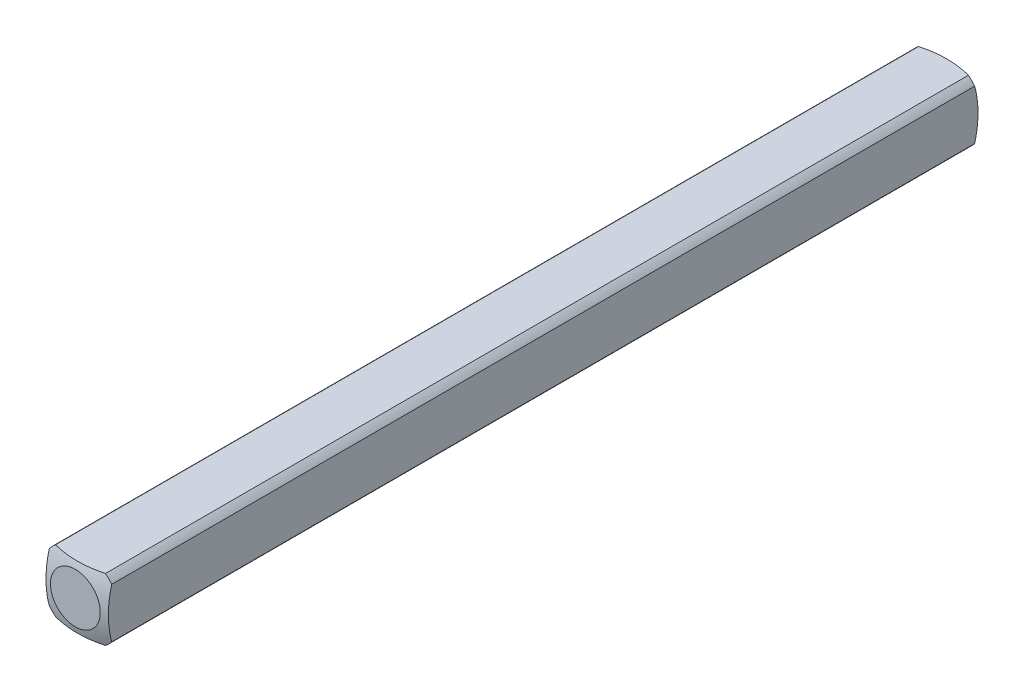
ISO-10303-21;
HEADER;
FILE_DESCRIPTION(('STEP AP214'),'2;1');
FILE_NAME('part.step','',(''),(''),'','','');
FILE_SCHEMA(('AUTOMOTIVE_DESIGN { 1 0 10303 214 1 1 1 1 }'));
ENDSEC;
DATA;
#1=APPLICATION_CONTEXT('core data for automotive mechanical design processes');
#2=APPLICATION_PROTOCOL_DEFINITION('international standard','automotive_design',2000,#1);
#3=PRODUCT_CONTEXT('',#1,'mechanical');
#4=PRODUCT('Part','Part','',(#3));
#5=PRODUCT_RELATED_PRODUCT_CATEGORY('part','',(#4));
#6=PRODUCT_DEFINITION_FORMATION('','',#4);
#7=PRODUCT_DEFINITION_CONTEXT('part definition',#1,'design');
#8=PRODUCT_DEFINITION('design','',#6,#7);
#9=PRODUCT_DEFINITION_SHAPE('','',#8);
#10=(LENGTH_UNIT() NAMED_UNIT(*) SI_UNIT(.MILLI.,.METRE.));
#11=(NAMED_UNIT(*) PLANE_ANGLE_UNIT() SI_UNIT($,.RADIAN.));
#12=(NAMED_UNIT(*) SI_UNIT($,.STERADIAN.) SOLID_ANGLE_UNIT());
#13=UNCERTAINTY_MEASURE_WITH_UNIT(LENGTH_MEASURE(1.E-05),#10,'distance_accuracy_value','');
#14=(GEOMETRIC_REPRESENTATION_CONTEXT(3) GLOBAL_UNCERTAINTY_ASSIGNED_CONTEXT((#13)) GLOBAL_UNIT_ASSIGNED_CONTEXT((#10,
#11,#12)) REPRESENTATION_CONTEXT('',''));
#15=CARTESIAN_POINT('',(0.,0.,0.));
#16=DIRECTION('',(0.,0.,1.));
#17=DIRECTION('',(1.,0.,0.));
#18=AXIS2_PLACEMENT_3D('',#15,#16,#17);
#19=CARTESIAN_POINT('',(-1.5875,-1.5875,22.225));
#20=DIRECTION('',(1.,0.,0.));
#21=DIRECTION('',(0.,0.,-1.));
#22=AXIS2_PLACEMENT_3D('',#19,#20,#21);
#23=PLANE('',#22);
#24=CARTESIAN_POINT('',(-1.5875,0.,4.91912226376204));
#25=DIRECTION('',(1.,0.,0.));
#26=DIRECTION('',(0.,0.,-1.));
#27=AXIS2_PLACEMENT_3D('',#24,#25,#26);
#28=CIRCLE('',#27,4.82558221875869);
#29=CARTESIAN_POINT('',(-1.5875,-1.26841150657032,0.263225357686904));
#30=VERTEX_POINT('',#29);
#31=CARTESIAN_POINT('',(-1.5875,1.26841150657032,0.263225357686903));
#32=VERTEX_POINT('',#31);
#33=EDGE_CURVE('E50',#30,#32,#28,.T.);
#34=ORIENTED_EDGE('',*,*,#33,.F.);
#35=DIRECTION('',(0.,0.,-1.));
#36=VECTOR('',#35,1.);
#37=CARTESIAN_POINT('',(-1.5875,-1.26841150657032,22.225));
#38=LINE('',#37,#36);
#39=CARTESIAN_POINT('',(-1.5875,-1.26841150657032,44.1867746423131));
#40=VERTEX_POINT('',#39);
#41=EDGE_CURVE('E43',#40,#30,#38,.T.);
#42=ORIENTED_EDGE('',*,*,#41,.F.);
#43=CARTESIAN_POINT('',(-1.5875,0.,39.530877736238));
#44=DIRECTION('',(-1.,0.,0.));
#45=DIRECTION('',(0.,0.,1.));
#46=AXIS2_PLACEMENT_3D('',#43,#44,#45);
#47=CIRCLE('',#46,4.82558221875869);
#48=CARTESIAN_POINT('',(-1.5875,1.26841150657032,44.1867746423131));
#49=VERTEX_POINT('',#48);
#50=EDGE_CURVE('E126',#40,#49,#47,.T.);
#51=ORIENTED_EDGE('',*,*,#50,.T.);
#52=DIRECTION('',(0.,0.,-1.));
#53=VECTOR('',#52,1.);
#54=CARTESIAN_POINT('',(-1.5875,1.26841150657032,22.225));
#55=LINE('',#54,#53);
#56=EDGE_CURVE('E114',#32,#49,#55,.F.);
#57=ORIENTED_EDGE('',*,*,#56,.F.);
#58=EDGE_LOOP('',(#34,#42,#51,#57));
#59=FACE_BOUND('',#58,.T.);
#60=ADVANCED_FACE('F36',(#59),#23,.F.);
#61=CARTESIAN_POINT('',(-1.5875,-1.5875,22.225));
#62=DIRECTION('',(0.,1.,0.));
#63=DIRECTION('',(0.,0.,1.));
#64=AXIS2_PLACEMENT_3D('',#61,#62,#63);
#65=PLANE('',#64);
#66=CARTESIAN_POINT('',(0.,-1.5875,4.91912226376204));
#67=DIRECTION('',(0.,1.,0.));
#68=DIRECTION('',(0.,0.,1.));
#69=AXIS2_PLACEMENT_3D('',#66,#67,#68);
#70=CIRCLE('',#69,4.82558221875869);
#71=CARTESIAN_POINT('',(1.26841150657032,-1.5875,0.263225357686905));
#72=VERTEX_POINT('',#71);
#73=CARTESIAN_POINT('',(-1.26841150657032,-1.5875,0.263225357686904));
#74=VERTEX_POINT('',#73);
#75=EDGE_CURVE('E155',#72,#74,#70,.T.);
#76=ORIENTED_EDGE('',*,*,#75,.F.);
#77=DIRECTION('',(0.,0.,-1.));
#78=VECTOR('',#77,1.);
#79=CARTESIAN_POINT('',(1.26841150657032,-1.5875,22.225));
#80=LINE('',#79,#78);
#81=CARTESIAN_POINT('',(1.26841150657032,-1.5875,44.1867746423131));
#82=VERTEX_POINT('',#81);
#83=EDGE_CURVE('E168',#82,#72,#80,.T.);
#84=ORIENTED_EDGE('',*,*,#83,.F.);
#85=CARTESIAN_POINT('',(0.,-1.5875,39.530877736238));
#86=DIRECTION('',(0.,-1.,0.));
#87=DIRECTION('',(0.,0.,-1.));
#88=AXIS2_PLACEMENT_3D('',#85,#86,#87);
#89=CIRCLE('',#88,4.82558221875869);
#90=CARTESIAN_POINT('',(-1.26841150657032,-1.5875,44.1867746423131));
#91=VERTEX_POINT('',#90);
#92=EDGE_CURVE('E137',#82,#91,#89,.T.);
#93=ORIENTED_EDGE('',*,*,#92,.T.);
#94=DIRECTION('',(0.,0.,-1.));
#95=VECTOR('',#94,1.);
#96=CARTESIAN_POINT('',(-1.26841150657032,-1.5875,22.225));
#97=LINE('',#96,#95);
#98=EDGE_CURVE('E166',#74,#91,#97,.F.);
#99=ORIENTED_EDGE('',*,*,#98,.F.);
#100=EDGE_LOOP('',(#76,#84,#93,#99));
#101=FACE_BOUND('',#100,.T.);
#102=ADVANCED_FACE('F178',(#101),#65,.F.);
#103=CARTESIAN_POINT('',(1.5875,-1.5875,22.225));
#104=DIRECTION('',(-1.,0.,0.));
#105=DIRECTION('',(0.,0.,1.));
#106=AXIS2_PLACEMENT_3D('',#103,#104,#105);
#107=PLANE('',#106);
#108=CARTESIAN_POINT('',(1.5875,0.,4.91912226376204));
#109=DIRECTION('',(-1.,0.,0.));
#110=DIRECTION('',(0.,0.,1.));
#111=AXIS2_PLACEMENT_3D('',#108,#109,#110);
#112=CIRCLE('',#111,4.82558221875869);
#113=CARTESIAN_POINT('',(1.5875,1.26841150657032,0.263225357686904));
#114=VERTEX_POINT('',#113);
#115=CARTESIAN_POINT('',(1.5875,-1.26841150657032,0.263225357686904));
#116=VERTEX_POINT('',#115);
#117=EDGE_CURVE('E153',#114,#116,#112,.T.);
#118=ORIENTED_EDGE('',*,*,#117,.F.);
#119=DIRECTION('',(0.,0.,-1.));
#120=VECTOR('',#119,1.);
#121=CARTESIAN_POINT('',(1.5875,1.26841150657032,22.225));
#122=LINE('',#121,#120);
#123=CARTESIAN_POINT('',(1.5875,1.26841150657032,44.1867746423131));
#124=VERTEX_POINT('',#123);
#125=EDGE_CURVE('E163',#124,#114,#122,.T.);
#126=ORIENTED_EDGE('',*,*,#125,.F.);
#127=CARTESIAN_POINT('',(1.5875,0.,39.530877736238));
#128=DIRECTION('',(1.,0.,0.));
#129=DIRECTION('',(0.,0.,-1.));
#130=AXIS2_PLACEMENT_3D('',#127,#128,#129);
#131=CIRCLE('',#130,4.82558221875869);
#132=CARTESIAN_POINT('',(1.5875,-1.26841150657032,44.1867746423131));
#133=VERTEX_POINT('',#132);
#134=EDGE_CURVE('E134',#124,#133,#131,.T.);
#135=ORIENTED_EDGE('',*,*,#134,.T.);
#136=DIRECTION('',(0.,0.,-1.));
#137=VECTOR('',#136,1.);
#138=CARTESIAN_POINT('',(1.5875,-1.26841150657032,22.225));
#139=LINE('',#138,#137);
#140=EDGE_CURVE('E107',#116,#133,#139,.F.);
#141=ORIENTED_EDGE('',*,*,#140,.F.);
#142=EDGE_LOOP('',(#118,#126,#135,#141));
#143=FACE_BOUND('',#142,.T.);
#144=ADVANCED_FACE('F185',(#143),#107,.F.);
#145=CARTESIAN_POINT('',(-1.5875,1.5875,22.225));
#146=DIRECTION('',(0.,-1.,0.));
#147=DIRECTION('',(0.,0.,-1.));
#148=AXIS2_PLACEMENT_3D('',#145,#146,#147);
#149=PLANE('',#148);
#150=CARTESIAN_POINT('',(0.,1.5875,4.91912226376204));
#151=DIRECTION('',(0.,-1.,0.));
#152=DIRECTION('',(0.,0.,-1.));
#153=AXIS2_PLACEMENT_3D('',#150,#151,#152);
#154=CIRCLE('',#153,4.82558221875869);
#155=CARTESIAN_POINT('',(-1.26841150657032,1.5875,0.263225357686904));
#156=VERTEX_POINT('',#155);
#157=CARTESIAN_POINT('',(1.26841150657032,1.5875,0.263225357686904));
#158=VERTEX_POINT('',#157);
#159=EDGE_CURVE('E105',#156,#158,#154,.T.);
#160=ORIENTED_EDGE('',*,*,#159,.F.);
#161=DIRECTION('',(0.,0.,-1.));
#162=VECTOR('',#161,1.);
#163=CARTESIAN_POINT('',(-1.26841150657032,1.5875,22.225));
#164=LINE('',#163,#162);
#165=CARTESIAN_POINT('',(-1.26841150657032,1.5875,44.1867746423131));
#166=VERTEX_POINT('',#165);
#167=EDGE_CURVE('E99',#166,#156,#164,.T.);
#168=ORIENTED_EDGE('',*,*,#167,.F.);
#169=CARTESIAN_POINT('',(0.,1.5875,39.530877736238));
#170=DIRECTION('',(0.,1.,0.));
#171=DIRECTION('',(0.,0.,1.));
#172=AXIS2_PLACEMENT_3D('',#169,#170,#171);
#173=CIRCLE('',#172,4.82558221875869);
#174=CARTESIAN_POINT('',(1.26841150657032,1.5875,44.1867746423131));
#175=VERTEX_POINT('',#174);
#176=EDGE_CURVE('E104',#166,#175,#173,.T.);
#177=ORIENTED_EDGE('',*,*,#176,.T.);
#178=DIRECTION('',(0.,0.,-1.));
#179=VECTOR('',#178,1.);
#180=CARTESIAN_POINT('',(1.26841150657032,1.5875,22.225));
#181=LINE('',#180,#179);
#182=EDGE_CURVE('E108',#158,#175,#181,.F.);
#183=ORIENTED_EDGE('',*,*,#182,.F.);
#184=EDGE_LOOP('',(#160,#168,#177,#183));
#185=FACE_BOUND('',#184,.T.);
#186=ADVANCED_FACE('F101',(#185),#149,.F.);
#187=CARTESIAN_POINT('',(0.,0.,22.225));
#188=DIRECTION('',(0.,0.,-1.));
#189=DIRECTION('',(-1.,0.,0.));
#190=AXIS2_PLACEMENT_3D('',#187,#188,#189);
#191=CYLINDRICAL_SURFACE('',#190,2.032);
#192=ORIENTED_EDGE('',*,*,#41,.T.);
#193=CARTESIAN_POINT('',(0.,0.,0.263225357686904));
#194=DIRECTION('',(0.,0.,1.));
#195=DIRECTION('',(1.,0.,0.));
#196=AXIS2_PLACEMENT_3D('',#193,#194,#195);
#197=CIRCLE('',#196,2.032);
#198=EDGE_CURVE('E150',#30,#74,#197,.T.);
#199=ORIENTED_EDGE('',*,*,#198,.T.);
#200=ORIENTED_EDGE('',*,*,#98,.T.);
#201=CARTESIAN_POINT('',(0.,0.,44.1867746423131));
#202=DIRECTION('',(0.,0.,1.));
#203=DIRECTION('',(1.,0.,0.));
#204=AXIS2_PLACEMENT_3D('',#201,#202,#203);
#205=CIRCLE('',#204,2.032);
#206=EDGE_CURVE('E131',#40,#91,#205,.T.);
#207=ORIENTED_EDGE('',*,*,#206,.F.);
#208=EDGE_LOOP('',(#192,#199,#200,#207));
#209=FACE_BOUND('',#208,.T.);
#210=ADVANCED_FACE('F174',(#209),#191,.T.);
#211=ORIENTED_EDGE('',*,*,#83,.T.);
#212=CARTESIAN_POINT('',(0.,0.,0.263225357686904));
#213=DIRECTION('',(0.,0.,1.));
#214=DIRECTION('',(1.,0.,0.));
#215=AXIS2_PLACEMENT_3D('',#212,#213,#214);
#216=CIRCLE('',#215,2.032);
#217=EDGE_CURVE('E56',#72,#116,#216,.T.);
#218=ORIENTED_EDGE('',*,*,#217,.T.);
#219=ORIENTED_EDGE('',*,*,#140,.T.);
#220=CARTESIAN_POINT('',(0.,0.,44.1867746423131));
#221=DIRECTION('',(0.,0.,1.));
#222=DIRECTION('',(1.,0.,0.));
#223=AXIS2_PLACEMENT_3D('',#220,#221,#222);
#224=CIRCLE('',#223,2.032);
#225=EDGE_CURVE('E140',#82,#133,#224,.T.);
#226=ORIENTED_EDGE('',*,*,#225,.F.);
#227=EDGE_LOOP('',(#211,#218,#219,#226));
#228=FACE_BOUND('',#227,.T.);
#229=ADVANCED_FACE('F181',(#228),#191,.T.);
#230=ORIENTED_EDGE('',*,*,#125,.T.);
#231=CARTESIAN_POINT('',(0.,0.,0.263225357686904));
#232=DIRECTION('',(0.,0.,1.));
#233=DIRECTION('',(1.,0.,0.));
#234=AXIS2_PLACEMENT_3D('',#231,#232,#233);
#235=CIRCLE('',#234,2.032);
#236=EDGE_CURVE('E147',#114,#158,#235,.T.);
#237=ORIENTED_EDGE('',*,*,#236,.T.);
#238=ORIENTED_EDGE('',*,*,#182,.T.);
#239=CARTESIAN_POINT('',(0.,0.,44.1867746423131));
#240=DIRECTION('',(0.,0.,1.));
#241=DIRECTION('',(1.,0.,0.));
#242=AXIS2_PLACEMENT_3D('',#239,#240,#241);
#243=CIRCLE('',#242,2.032);
#244=EDGE_CURVE('E125',#124,#175,#243,.T.);
#245=ORIENTED_EDGE('',*,*,#244,.F.);
#246=EDGE_LOOP('',(#230,#237,#238,#245));
#247=FACE_BOUND('',#246,.T.);
#248=ADVANCED_FACE('F187',(#247),#191,.T.);
#249=ORIENTED_EDGE('',*,*,#167,.T.);
#250=CARTESIAN_POINT('',(0.,0.,0.263225357686904));
#251=DIRECTION('',(0.,0.,1.));
#252=DIRECTION('',(1.,0.,0.));
#253=AXIS2_PLACEMENT_3D('',#250,#251,#252);
#254=CIRCLE('',#253,2.032);
#255=EDGE_CURVE('E12',#156,#32,#254,.T.);
#256=ORIENTED_EDGE('',*,*,#255,.T.);
#257=ORIENTED_EDGE('',*,*,#56,.T.);
#258=CARTESIAN_POINT('',(0.,0.,44.1867746423131));
#259=DIRECTION('',(0.,0.,1.));
#260=DIRECTION('',(1.,0.,0.));
#261=AXIS2_PLACEMENT_3D('',#258,#259,#260);
#262=CIRCLE('',#261,2.032);
#263=EDGE_CURVE('E111',#166,#49,#262,.T.);
#264=ORIENTED_EDGE('',*,*,#263,.F.);
#265=EDGE_LOOP('',(#249,#256,#257,#264));
#266=FACE_BOUND('',#265,.T.);
#267=ADVANCED_FACE('F112',(#266),#191,.T.);
#268=CARTESIAN_POINT('',(0.,0.,4.91912226376204));
#269=DIRECTION('',(0.,0.,1.));
#270=DIRECTION('',(-1.,0.,0.));
#271=AXIS2_PLACEMENT_3D('',#268,#269,#270);
#272=SPHERICAL_SURFACE('',#271,5.08);
#273=CARTESIAN_POINT('',(0.,0.,0.));
#274=DIRECTION('',(0.,0.,-1.));
#275=DIRECTION('',(-1.,0.,0.));
#276=AXIS2_PLACEMENT_3D('',#273,#274,#275);
#277=CIRCLE('',#276,1.26832020963187);
#278=CARTESIAN_POINT('',(-1.26832020963187,0.,0.));
#279=VERTEX_POINT('',#278);
#280=EDGE_CURVE('E158',#279,#279,#277,.T.);
#281=ORIENTED_EDGE('',*,*,#280,.F.);
#282=EDGE_LOOP('',(#281));
#283=FACE_BOUND('',#282,.T.);
#284=ORIENTED_EDGE('',*,*,#75,.T.);
#285=ORIENTED_EDGE('',*,*,#198,.F.);
#286=ORIENTED_EDGE('',*,*,#33,.T.);
#287=ORIENTED_EDGE('',*,*,#255,.F.);
#288=ORIENTED_EDGE('',*,*,#159,.T.);
#289=ORIENTED_EDGE('',*,*,#236,.F.);
#290=ORIENTED_EDGE('',*,*,#117,.T.);
#291=ORIENTED_EDGE('',*,*,#217,.F.);
#292=EDGE_LOOP('',(#284,#285,#286,#287,#288,#289,#290,#291));
#293=FACE_BOUND('',#292,.T.);
#294=ADVANCED_FACE('F188',(#283,#293),#272,.T.);
#295=CARTESIAN_POINT('',(0.,0.,0.));
#296=DIRECTION('',(0.,0.,-1.));
#297=DIRECTION('',(-1.,0.,0.));
#298=AXIS2_PLACEMENT_3D('',#295,#296,#297);
#299=PLANE('',#298);
#300=ORIENTED_EDGE('',*,*,#280,.T.);
#301=EDGE_LOOP('',(#300));
#302=FACE_BOUND('',#301,.T.);
#303=ADVANCED_FACE('F190',(#302),#299,.T.);
#304=CARTESIAN_POINT('',(0.,0.,39.530877736238));
#305=DIRECTION('',(0.,0.,-1.));
#306=DIRECTION('',(-1.,0.,0.));
#307=AXIS2_PLACEMENT_3D('',#304,#305,#306);
#308=SPHERICAL_SURFACE('',#307,5.08);
#309=CARTESIAN_POINT('',(0.,0.,44.45));
#310=DIRECTION('',(0.,0.,-1.));
#311=DIRECTION('',(-1.,0.,0.));
#312=AXIS2_PLACEMENT_3D('',#309,#310,#311);
#313=CIRCLE('',#312,1.26832020963187);
#314=CARTESIAN_POINT('',(-1.26832020963187,0.,44.45));
#315=VERTEX_POINT('',#314);
#316=EDGE_CURVE('E118',#315,#315,#313,.T.);
#317=ORIENTED_EDGE('',*,*,#316,.T.);
#318=EDGE_LOOP('',(#317));
#319=FACE_BOUND('',#318,.T.);
#320=ORIENTED_EDGE('',*,*,#92,.F.);
#321=ORIENTED_EDGE('',*,*,#225,.T.);
#322=ORIENTED_EDGE('',*,*,#134,.F.);
#323=ORIENTED_EDGE('',*,*,#244,.T.);
#324=ORIENTED_EDGE('',*,*,#176,.F.);
#325=ORIENTED_EDGE('',*,*,#263,.T.);
#326=ORIENTED_EDGE('',*,*,#50,.F.);
#327=ORIENTED_EDGE('',*,*,#206,.T.);
#328=EDGE_LOOP('',(#320,#321,#322,#323,#324,#325,#326,#327));
#329=FACE_BOUND('',#328,.T.);
#330=ADVANCED_FACE('F122',(#319,#329),#308,.T.);
#331=CARTESIAN_POINT('',(0.,0.,44.45));
#332=DIRECTION('',(0.,0.,1.));
#333=DIRECTION('',(-1.,0.,0.));
#334=AXIS2_PLACEMENT_3D('',#331,#332,#333);
#335=PLANE('',#334);
#336=ORIENTED_EDGE('',*,*,#316,.F.);
#337=EDGE_LOOP('',(#336));
#338=FACE_BOUND('',#337,.T.);
#339=ADVANCED_FACE('F235',(#338),#335,.T.);
#340=CLOSED_SHELL('',(#60,#102,#144,#186,#210,#229,#248,#267,#294,#303,#330,#339));
#341=MANIFOLD_SOLID_BREP('B2',#340);
#342=ADVANCED_BREP_SHAPE_REPRESENTATION('',(#18,#341),#14);
#343=SHAPE_DEFINITION_REPRESENTATION(#9,#342);
ENDSEC;
END-ISO-10303-21;
